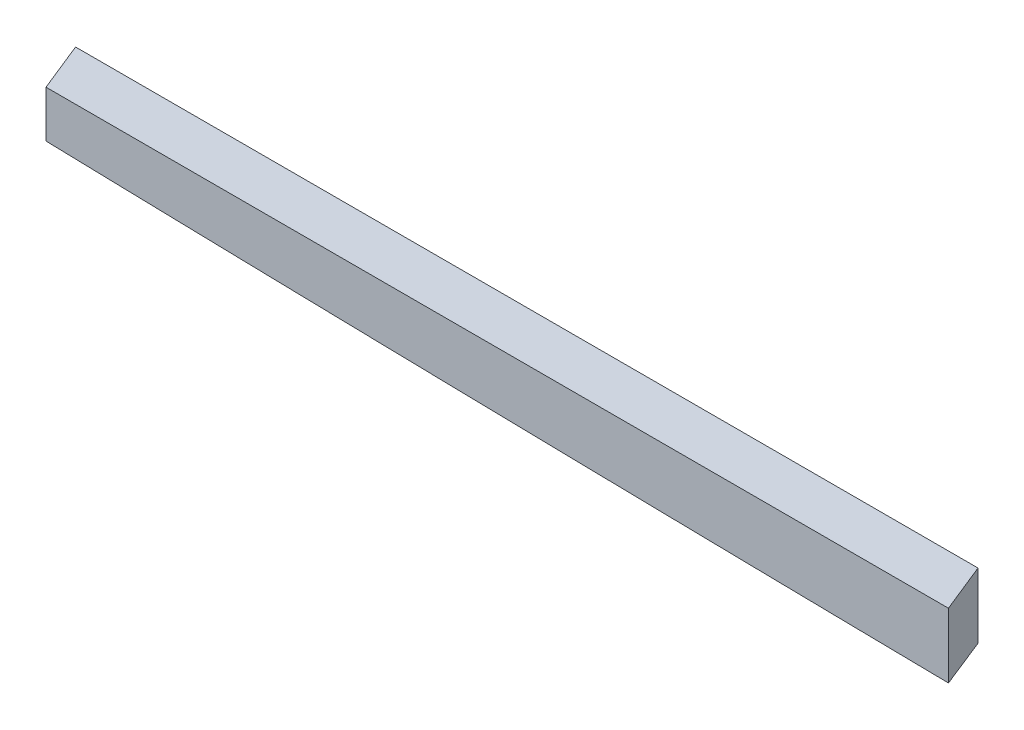
ISO-10303-21;
HEADER;
FILE_DESCRIPTION(('STEP AP214'),'2;1');
FILE_NAME('part.step','',(''),(''),'','','');
FILE_SCHEMA(('AUTOMOTIVE_DESIGN { 1 0 10303 214 1 1 1 1 }'));
ENDSEC;
DATA;
#1=APPLICATION_CONTEXT('core data for automotive mechanical design processes');
#2=APPLICATION_PROTOCOL_DEFINITION('international standard','automotive_design',2000,#1);
#3=PRODUCT_CONTEXT('',#1,'mechanical');
#4=PRODUCT('Part','Part','',(#3));
#5=PRODUCT_RELATED_PRODUCT_CATEGORY('part','',(#4));
#6=PRODUCT_DEFINITION_FORMATION('','',#4);
#7=PRODUCT_DEFINITION_CONTEXT('part definition',#1,'design');
#8=PRODUCT_DEFINITION('design','',#6,#7);
#9=PRODUCT_DEFINITION_SHAPE('','',#8);
#10=(LENGTH_UNIT() NAMED_UNIT(*) SI_UNIT(.MILLI.,.METRE.));
#11=(NAMED_UNIT(*) PLANE_ANGLE_UNIT() SI_UNIT($,.RADIAN.));
#12=(NAMED_UNIT(*) SI_UNIT($,.STERADIAN.) SOLID_ANGLE_UNIT());
#13=UNCERTAINTY_MEASURE_WITH_UNIT(LENGTH_MEASURE(1.E-05),#10,'distance_accuracy_value','');
#14=(GEOMETRIC_REPRESENTATION_CONTEXT(3) GLOBAL_UNCERTAINTY_ASSIGNED_CONTEXT((#13)) GLOBAL_UNIT_ASSIGNED_CONTEXT((#10,
#11,#12)) REPRESENTATION_CONTEXT('',''));
#15=CARTESIAN_POINT('',(0.,0.,0.));
#16=DIRECTION('',(0.,0.,1.));
#17=DIRECTION('',(1.,0.,0.));
#18=AXIS2_PLACEMENT_3D('',#15,#16,#17);
#19=CARTESIAN_POINT('',(0.,0.,0.));
#20=DIRECTION('',(0.,1.,0.));
#21=DIRECTION('',(0.,0.,-1.));
#22=AXIS2_PLACEMENT_3D('',#19,#20,#21);
#23=PLANE('',#22);
#24=DIRECTION('',(0.374606593415913,0.,0.927183854566787));
#25=VECTOR('',#24,1.);
#26=CARTESIAN_POINT('',(8.72292621578678,0.,-10.1599999999991));
#27=LINE('',#26,#25);
#28=CARTESIAN_POINT('',(8.72292621578678,0.,-10.1599999999991));
#29=VERTEX_POINT('',#28);
#30=CARTESIAN_POINT('',(12.827832670272,0.,9.31640630955923E-13));
#31=VERTEX_POINT('',#30);
#32=EDGE_CURVE('E96',#29,#31,#27,.T.);
#33=ORIENTED_EDGE('',*,*,#32,.F.);
#34=DIRECTION('',(1.,0.,0.));
#35=VECTOR('',#34,1.);
#36=CARTESIAN_POINT('',(-176.191855416285,0.,-10.1599999999991));
#37=LINE('',#36,#35);
#38=CARTESIAN_POINT('',(-176.191855416285,0.,-10.1599999999991));
#39=VERTEX_POINT('',#38);
#40=EDGE_CURVE('E100',#39,#29,#37,.T.);
#41=ORIENTED_EDGE('',*,*,#40,.F.);
#42=DIRECTION('',(-0.374606593415916,0.,-0.927183854566786));
#43=VECTOR('',#42,1.);
#44=CARTESIAN_POINT('',(-172.0869489618,0.,9.08995101411848E-13));
#45=LINE('',#44,#43);
#46=CARTESIAN_POINT('',(-172.0869489618,0.,9.08995101411848E-13));
#47=VERTEX_POINT('',#46);
#48=EDGE_CURVE('E149',#47,#39,#45,.T.);
#49=ORIENTED_EDGE('',*,*,#48,.F.);
#50=DIRECTION('',(-1.,0.,0.));
#51=VECTOR('',#50,1.);
#52=CARTESIAN_POINT('',(12.827832670272,0.,9.31640630955923E-13));
#53=LINE('',#52,#51);
#54=EDGE_CURVE('E147',#31,#47,#53,.T.);
#55=ORIENTED_EDGE('',*,*,#54,.F.);
#56=EDGE_LOOP('',(#33,#41,#49,#55));
#57=FACE_BOUND('',#56,.T.);
#58=ADVANCED_FACE('F38',(#57),#23,.T.);
#59=CARTESIAN_POINT('',(12.827832670272,-176.191855416285,9.31640630955923E-13));
#60=DIRECTION('',(0.,0.,1.));
#61=DIRECTION('',(-1.,0.,0.));
#62=AXIS2_PLACEMENT_3D('',#59,#60,#61);
#63=PLANE('',#62);
#64=DIRECTION('',(0.,1.,0.));
#65=VECTOR('',#64,1.);
#66=CARTESIAN_POINT('',(12.827832670272,-176.191855416285,9.31640630955923E-13));
#67=LINE('',#66,#65);
#68=CARTESIAN_POINT('',(12.8278326702685,-13.2753089407098,-7.82859020664883E-12));
#69=VERTEX_POINT('',#68);
#70=EDGE_CURVE('E86',#69,#31,#67,.T.);
#71=ORIENTED_EDGE('',*,*,#70,.T.);
#72=ORIENTED_EDGE('',*,*,#54,.T.);
#73=DIRECTION('',(0.,1.,0.));
#74=VECTOR('',#73,1.);
#75=CARTESIAN_POINT('',(-172.0869489618,-176.191855416285,9.08995101411848E-13));
#76=LINE('',#75,#74);
#77=CARTESIAN_POINT('',(-172.0869489618,-9.56228818097515,9.08995101411848E-13));
#78=VERTEX_POINT('',#77);
#79=EDGE_CURVE('E104',#78,#47,#76,.T.);
#80=ORIENTED_EDGE('',*,*,#79,.F.);
#81=CARTESIAN_POINT('',(12.827832670272,-13.2753089407097,9.3002147562763E-13));
#82=CARTESIAN_POINT('',(5.03889789984685,-13.1623724498101,9.45358762278889E-13));
#83=CARTESIAN_POINT('',(-2.74995179605478,-13.0435926326943,9.38307586140524E-13));
#84=CARTESIAN_POINT('',(-18.3274730010923,-12.7948590293066,9.19250522724345E-13));
#85=CARTESIAN_POINT('',(-26.1161445102258,-12.6649052428759,9.07244635376131E-13));
#86=CARTESIAN_POINT('',(-37.7990113753512,-12.4619786110489,9.15386432806479E-13));
#87=CARTESIAN_POINT('',(-41.693276648536,-12.3930037470293,9.22458801899214E-13));
#88=CARTESIAN_POINT('',(-49.4817601393055,-12.2524526830507,9.26514825358838E-13));
#89=CARTESIAN_POINT('',(-53.3759783568924,-12.1808764832096,9.2349848018256E-13));
#90=CARTESIAN_POINT('',(-61.1643672634273,-12.0351881662414,9.22613722121077E-13));
#91=CARTESIAN_POINT('',(-65.0585379523761,-11.9610760491558,9.24745309151858E-13));
#92=CARTESIAN_POINT('',(-72.8468316955199,-11.8103628093828,9.1850550258769E-13));
#93=CARTESIAN_POINT('',(-76.7409547497081,-11.7337616863414,9.10134107498903E-13));
#94=CARTESIAN_POINT('',(-85.7160358914114,-11.5543777440052,9.06184959815261E-13));
#95=CARTESIAN_POINT('',(-90.7969767380808,-11.4507310254146,9.1528426696584E-13));
#96=CARTESIAN_POINT('',(-100.958769042322,-11.2391420249903,9.21371776104001E-13));
#97=CARTESIAN_POINT('',(-106.039620499893,-11.1311997431206,9.1835997799005E-13));
#98=CARTESIAN_POINT('',(-116.201223125295,-10.9107513882215,9.14562717660356E-13));
#99=CARTESIAN_POINT('',(-121.281974293154,-10.7982453164831,9.13777254814898E-13));
#100=CARTESIAN_POINT('',(-131.443364932014,-10.5680040993975,9.15412168333865E-13));
#101=CARTESIAN_POINT('',(-136.524004402861,-10.4502689473115,9.17832548829897E-13));
#102=CARTESIAN_POINT('',(-146.685136458542,-10.2085603455666,9.07623682721347E-13));
#103=CARTESIAN_POINT('',(-151.765629043351,-10.0845868948889,8.94994433658483E-13));
#104=CARTESIAN_POINT('',(-161.926434703332,-9.82925894887641,9.26728737482133E-13));
#105=CARTESIAN_POINT('',(-167.006747778275,-9.69790444447692,9.71092360363969E-13));
#106=CARTESIAN_POINT('',(-172.0869489618,-9.56228818097515,1.07997378401281E-12));
#107=B_SPLINE_CURVE_WITH_KNOTS('',3,(#81,#82,#83,#84,#85,#86,#87,#88,#89,#90,#91,#92,#93,#94,
#95,#96,#97,#98,#99,#100,#101,#102,#103,#104,#105,#106),.UNSPECIFIED.,.F.,.F.,(4,2,2,2,2,2,2,2,
2,2,2,2,4),(0.,23.3692580337676,46.7385163995868,58.423143889633,70.1077708505829,
81.7923976208377,93.4770260529948,108.723017887645,123.969009850108,139.21499750027,
154.461004799081,169.707014588253,184.953043101703),.UNSPECIFIED.);
#108=EDGE_CURVE('E11',#69,#78,#107,.T.);
#109=ORIENTED_EDGE('',*,*,#108,.F.);
#110=EDGE_LOOP('',(#71,#72,#80,#109));
#111=FACE_BOUND('',#110,.T.);
#112=ADVANCED_FACE('F130',(#111),#63,.T.);
#113=CARTESIAN_POINT('',(-172.0869489618,-176.191855416285,9.08995101411848E-13));
#114=DIRECTION('',(-0.927183854566786,0.,0.374606593415916));
#115=DIRECTION('',(-0.374606593415916,0.,-0.927183854566786));
#116=AXIS2_PLACEMENT_3D('',#113,#114,#115);
#117=PLANE('',#116);
#118=ORIENTED_EDGE('',*,*,#79,.T.);
#119=ORIENTED_EDGE('',*,*,#48,.T.);
#120=DIRECTION('',(0.,1.,0.));
#121=VECTOR('',#120,1.);
#122=CARTESIAN_POINT('',(-176.191855416285,-176.191855416285,-10.1599999999991));
#123=LINE('',#122,#121);
#124=CARTESIAN_POINT('',(-176.191855416285,-9.31513763862024,-10.1599999999991));
#125=VERTEX_POINT('',#124);
#126=EDGE_CURVE('E102',#125,#39,#123,.T.);
#127=ORIENTED_EDGE('',*,*,#126,.F.);
#128=CARTESIAN_POINT('',(-143.412696143155,2833.48990261995,70.9712661829625));
#129=DIRECTION('',(-0.927183854566786,0.,0.374606593415916));
#130=DIRECTION('',(0.374595101191305,-0.00783296184731892,0.927155410312734));
#131=AXIS2_PLACEMENT_3D('',#128,#129,#130);
#132=ELLIPSE('',#131,3398.12195786294,2843.927294434);
#133=EDGE_CURVE('E58',#125,#78,#132,.T.);
#134=ORIENTED_EDGE('',*,*,#133,.T.);
#135=EDGE_LOOP('',(#118,#119,#127,#134));
#136=FACE_BOUND('',#135,.T.);
#137=ADVANCED_FACE('F133',(#136),#117,.T.);
#138=CARTESIAN_POINT('',(-176.191855416285,-176.191855416285,-10.1599999999991));
#139=DIRECTION('',(0.,0.,-1.));
#140=DIRECTION('',(1.,0.,0.));
#141=AXIS2_PLACEMENT_3D('',#138,#139,#140);
#142=PLANE('',#141);
#143=ORIENTED_EDGE('',*,*,#126,.T.);
#144=ORIENTED_EDGE('',*,*,#40,.T.);
#145=DIRECTION('',(0.,1.,0.));
#146=VECTOR('',#145,1.);
#147=CARTESIAN_POINT('',(8.72292621578678,-176.191855416285,-10.1599999999991));
#148=LINE('',#147,#146);
#149=CARTESIAN_POINT('',(8.72292621578657,-13.3636516708609,-10.1599999999996));
#150=VERTEX_POINT('',#149);
#151=EDGE_CURVE('E50',#150,#29,#148,.T.);
#152=ORIENTED_EDGE('',*,*,#151,.F.);
#153=CARTESIAN_POINT('',(-176.191855416285,-9.31513763862024,-10.1599999999991));
#154=CARTESIAN_POINT('',(-172.298635459249,-9.42940901660916,-10.1599999999991));
#155=CARTESIAN_POINT('',(-168.40532764399,-9.54065306863966,-10.1599999999991));
#156=CARTESIAN_POINT('',(-160.618562423321,-9.7577122598307,-10.1599999999991));
#157=CARTESIAN_POINT('',(-156.725105017985,-9.86352740162257,-10.1599999999991));
#158=CARTESIAN_POINT('',(-148.93807339934,-10.0703543439187,-10.1599999999991));
#159=CARTESIAN_POINT('',(-145.044499186372,-10.1713661572894,-10.1599999999991));
#160=CARTESIAN_POINT('',(-137.257242136974,-10.3691240301852,-10.1599999999991));
#161=CARTESIAN_POINT('',(-133.363559300528,-10.4658700891048,-10.1599999999991));
#162=CARTESIAN_POINT('',(-121.682390337375,-10.7504298136658,-10.1599999999991));
#163=CARTESIAN_POINT('',(-113.894765523565,-10.9325655067564,-10.1599999999991));
#164=CARTESIAN_POINT('',(-102.213121555967,-11.1967937663735,-10.1599999999991));
#165=CARTESIAN_POINT('',(-98.3192025867229,-11.2833740401368,-10.1599999999991));
#166=CARTESIAN_POINT('',(-90.5313063487404,-11.4538878646989,-10.1599999999991));
#167=CARTESIAN_POINT('',(-86.6373290799983,-11.5378214153373,-10.1599999999991));
#168=CARTESIAN_POINT('',(-77.6620792930694,-11.7286256722712,-10.1599999999991));
#169=CARTESIAN_POINT('',(-72.5807895916205,-11.8346873701496,-10.1599999999991));
#170=CARTESIAN_POINT('',(-62.4181345082441,-12.0431338076618,-10.1599999999991));
#171=CARTESIAN_POINT('',(-57.336769126312,-12.1455185470777,-10.1599999999991));
#172=CARTESIAN_POINT('',(-47.1739668545479,-12.3466795211718,-10.1599999999991));
#173=CARTESIAN_POINT('',(-42.0925299647147,-12.4454557557915,-10.1599999999991));
#174=CARTESIAN_POINT('',(-31.9296086938186,-12.639361023619,-10.1599999999991));
#175=CARTESIAN_POINT('',(-26.8481243130585,-12.7344900726925,-10.1599999999991));
#176=CARTESIAN_POINT('',(-16.6850861116655,-12.9209513475534,-10.1599999999991));
#177=CARTESIAN_POINT('',(-11.6035322910366,-13.0122835735504,-10.1599999999991));
#178=CARTESIAN_POINT('',(-1.44035518654288,-13.1909832205064,-10.1599999999991));
#179=CARTESIAN_POINT('',(3.64126809731869,-13.2783506416434,-10.1599999999991));
#180=CARTESIAN_POINT('',(8.72292621243653,-13.3636516708047,-10.1599999999991));
#181=B_SPLINE_CURVE_WITH_KNOTS('',3,(#153,#154,#155,#156,#157,#158,#159,#160,#161,#162,#163,
#164,#165,#166,#167,#168,#169,#170,#171,#172,#173,#174,#175,#176,#177,#178,#179,#180),
.UNSPECIFIED.,.F.,.F.,(4,2,2,2,2,2,2,2,2,2,2,2,2,4),(0.,11.6846871881095,23.3693687127593,
35.0540189365431,46.7386708186636,70.1079198642204,81.7925635246171,93.4772078926809,
108.724395968878,123.971584948218,139.218774174341,154.465897065981,169.713019115936,
184.960140481147),.UNSPECIFIED.);
#182=EDGE_CURVE('E92',#125,#150,#181,.T.);
#183=ORIENTED_EDGE('',*,*,#182,.F.);
#184=EDGE_LOOP('',(#143,#144,#152,#183));
#185=FACE_BOUND('',#184,.T.);
#186=ADVANCED_FACE('F98',(#185),#142,.T.);
#187=CARTESIAN_POINT('',(8.72292621578678,-176.191855416285,-10.1599999999991));
#188=DIRECTION('',(0.927183854566787,0.,-0.374606593415913));
#189=DIRECTION('',(0.374606593415913,0.,0.927183854566787));
#190=AXIS2_PLACEMENT_3D('',#187,#188,#189);
#191=PLANE('',#190);
#192=ORIENTED_EDGE('',*,*,#151,.T.);
#193=ORIENTED_EDGE('',*,*,#32,.T.);
#194=ORIENTED_EDGE('',*,*,#70,.F.);
#195=CARTESIAN_POINT('',(-113.63940637196,-5.40386964217287,-313.017400741279));
#196=CARTESIAN_POINT('',(-75.4785450254147,-13.185760843084,-218.565954507404));
#197=CARTESIAN_POINT('',(-19.0659570087697,-13.4131359684737,-78.9398995402184));
#198=CARTESIAN_POINT('',(37.568752556201,-13.4156283461592,61.2359255510887));
#199=CARTESIAN_POINT('',(55.4579622929257,-0.805593780103357,105.513273388462));
#200=B_SPLINE_CURVE_WITH_KNOTS('',3,(#195,#196,#197,#198,#199),.UNSPECIFIED.,.F.,.F.,(4,1,4),
(0.,0.6764636902794,1.),.UNSPECIFIED.);
#201=EDGE_CURVE('E83',#150,#69,#200,.T.);
#202=ORIENTED_EDGE('',*,*,#201,.F.);
#203=EDGE_LOOP('',(#192,#193,#194,#202));
#204=FACE_BOUND('',#203,.T.);
#205=ADVANCED_FACE('F40',(#204),#191,.T.);
#206=CARTESIAN_POINT('',(55.4579622929257,-0.805593780103357,105.513273388462));
#207=CARTESIAN_POINT('',(-129.457038163669,-0.805593929114935,105.512731778762));
#208=CARTESIAN_POINT('',(51.9241099828562,-3.29659256859822,96.7666819938946));
#209=CARTESIAN_POINT('',(-131.873885299639,-2.44130818532169,99.5308252058063));
#210=CARTESIAN_POINT('',(44.7681325619156,-7.32836318314609,79.0550163559808));
#211=CARTESIAN_POINT('',(-136.750685821155,-5.28961352317592,87.4603203482674));
#212=CARTESIAN_POINT('',(33.8940627543884,-10.9761744546051,52.1407491322396));
#213=CARTESIAN_POINT('',(-144.159114207432,-8.27702846951052,69.1238166449184));
#214=CARTESIAN_POINT('',(22.959272844251,-12.7985183605707,25.0761943807898));
#215=CARTESIAN_POINT('',(-151.624673731392,-9.97000758282254,50.6459084137686));
#216=CARTESIAN_POINT('',(15.6542234938843,-13.2005291414816,6.99556277014005));
#217=CARTESIAN_POINT('',(-156.615798281765,-10.2332991329444,38.292441655377));
#218=CARTESIAN_POINT('',(10.6903983915085,-13.3350068720629,-5.29033548340795));
#219=CARTESIAN_POINT('',(-160.001868802785,-10.1188005600373,29.9116230240611));
#220=CARTESIAN_POINT('',(8.07217015378236,-13.3798229212348,-11.7706777738471));
#221=CARTESIAN_POINT('',(-161.787718591263,-10.054213696795,25.4914896904226));
#222=CARTESIAN_POINT('',(4.14458327454184,-13.3956703477279,-21.4917964243055));
#223=CARTESIAN_POINT('',(-164.466300054886,-9.94474375287146,18.8617679240053));
#224=CARTESIAN_POINT('',(0.216825796528271,-13.3893005174341,-31.2133373215443));
#225=CARTESIAN_POINT('',(-167.144688351964,-9.82268525127191,12.2325242615639));
#226=CARTESIAN_POINT('',(-3.7110905440358,-13.3839147941131,-40.9352714173934));
#227=CARTESIAN_POINT('',(-169.822883535046,-9.6880392833806,5.60375857303416));
#228=CARTESIAN_POINT('',(-7.63915286757294,-13.3748815307504,-50.6575668337799));
#229=CARTESIAN_POINT('',(-172.500885656682,-9.54080694058175,-1.02452927164858));
#230=CARTESIAN_POINT('',(-12.8767468083435,-13.3570498959533,-63.6210667401139));
#231=CARTESIAN_POINT('',(-176.071297807002,-9.32771677215222,-9.86160944618207));
#232=CARTESIAN_POINT('',(-19.4240351809613,-13.318251392506,-79.8261741167054));
#233=CARTESIAN_POINT('',(-180.533830604033,-9.02989358126761,-20.9067657050536));
#234=CARTESIAN_POINT('',(-27.281130065861,-13.2313208682326,-99.2731663723646));
#235=CARTESIAN_POINT('',(-185.888098555478,-8.62217771472356,-34.1590439213424));
#236=CARTESIAN_POINT('',(-35.1384053211497,-13.089210066917,-118.720605060403));
#237=CARTESIAN_POINT('',(-191.241595288036,-8.1641315185446,-47.4094133039051));
#238=CARTESIAN_POINT('',(-42.9956686725627,-12.8774530793599,-138.168014285314));
#239=CARTESIAN_POINT('',(-196.594320987816,-7.65575270057834,-60.6578743133721));
#240=CARTESIAN_POINT('',(-53.4716318936368,-12.4827318000341,-164.096933130667));
#241=CARTESIAN_POINT('',(-203.730260791958,-6.91080105803709,-78.3199451093749));
#242=CARTESIAN_POINT('',(-66.5651199821171,-11.7422080133172,-196.504453363827));
#243=CARTESIAN_POINT('',(-212.648258895722,-5.85376848963036,-100.392764974793));
#244=CARTESIAN_POINT('',(-82.2714287437939,-10.341795890292,-235.37893169555));
#245=CARTESIAN_POINT('',(-223.346773255785,-4.38387852996698,-126.872517218468));
#246=CARTESIAN_POINT('',(-97.9667149716782,-8.31421385526929,-274.226128298792));
#247=CARTESIAN_POINT('',(-234.0422035292,-2.71243563952133,-153.344636079828));
#248=CARTESIAN_POINT('',(-108.418211399608,-6.46859328256996,-300.094489706089));
#249=CARTESIAN_POINT('',(-241.170431977793,-1.46364489167889,-170.987620601088));
#250=CARTESIAN_POINT('',(-113.63940637196,-5.40386964217287,-313.017400741279));
#251=CARTESIAN_POINT('',(-244.734031016355,-0.805593929115379,-179.807837732281));
#252=B_SPLINE_SURFACE_WITH_KNOTS('',3,1,((#206,#207),(#208,#209),(#210,#211),(#212,#213),(#214,
#215),(#216,#217),(#218,#219),(#220,#221),(#222,#223),(#224,#225),(#226,#227),(#228,#229),(#230,
#231),(#232,#233),(#234,#235),(#236,#237),(#238,#239),(#240,#241),(#242,#243),(#244,#245),(#246,
#247),(#248,#249),(#250,#251)),.UNSPECIFIED.,.F.,.F.,.F.,(4,1,1,1,2,1,1,1,1,1,1,1,1,1,1,1,1,1,1,
4),(2,2),(0.,0.0646770999637058,0.129354199927412,0.194031299891118,0.258708399854823,
0.28187376235936,0.305039124863897,0.328204487368434,0.35136984987297,0.374535212377507,
0.397700574882044,0.444031299891117,0.490362024900191,0.536692749909264,0.583023474918338,
0.629354199927412,0.722015649945559,0.814677099963706,0.907338549981853,1.),(0.,1.),.UNSPECIFIED.);
#253=ORIENTED_EDGE('',*,*,#182,.T.);
#254=ORIENTED_EDGE('',*,*,#201,.T.);
#255=ORIENTED_EDGE('',*,*,#108,.T.);
#256=ORIENTED_EDGE('',*,*,#133,.F.);
#257=EDGE_LOOP('',(#253,#254,#255,#256));
#258=FACE_BOUND('',#257,.T.);
#259=ADVANCED_FACE('F93',(#258),#252,.F.);
#260=CLOSED_SHELL('',(#58,#112,#137,#186,#205,#259));
#261=MANIFOLD_SOLID_BREP('B2',#260);
#262=ADVANCED_BREP_SHAPE_REPRESENTATION('',(#18,#261),#14);
#263=SHAPE_DEFINITION_REPRESENTATION(#9,#262);
ENDSEC;
END-ISO-10303-21;
